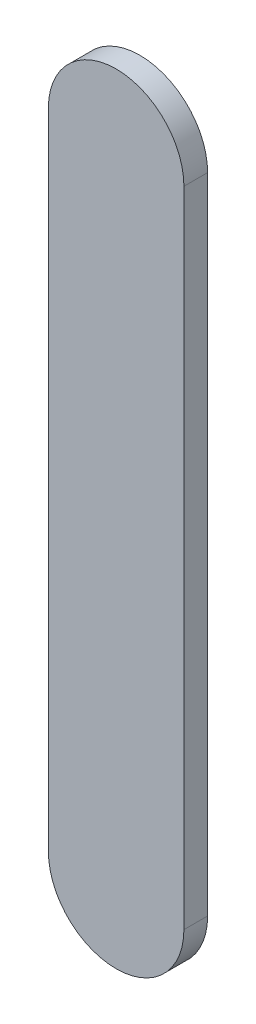
ISO-10303-21;
HEADER;
FILE_DESCRIPTION(('STEP AP214'),'2;1');
FILE_NAME('part.step','',(''),(''),'','','');
FILE_SCHEMA(('AUTOMOTIVE_DESIGN { 1 0 10303 214 1 1 1 1 }'));
ENDSEC;
DATA;
#1=APPLICATION_CONTEXT('core data for automotive mechanical design processes');
#2=APPLICATION_PROTOCOL_DEFINITION('international standard','automotive_design',2000,#1);
#3=PRODUCT_CONTEXT('',#1,'mechanical');
#4=PRODUCT('Part','Part','',(#3));
#5=PRODUCT_RELATED_PRODUCT_CATEGORY('part','',(#4));
#6=PRODUCT_DEFINITION_FORMATION('','',#4);
#7=PRODUCT_DEFINITION_CONTEXT('part definition',#1,'design');
#8=PRODUCT_DEFINITION('design','',#6,#7);
#9=PRODUCT_DEFINITION_SHAPE('','',#8);
#10=(LENGTH_UNIT() NAMED_UNIT(*) SI_UNIT(.MILLI.,.METRE.));
#11=(NAMED_UNIT(*) PLANE_ANGLE_UNIT() SI_UNIT($,.RADIAN.));
#12=(NAMED_UNIT(*) SI_UNIT($,.STERADIAN.) SOLID_ANGLE_UNIT());
#13=UNCERTAINTY_MEASURE_WITH_UNIT(LENGTH_MEASURE(1.E-05),#10,'distance_accuracy_value','');
#14=(GEOMETRIC_REPRESENTATION_CONTEXT(3) GLOBAL_UNCERTAINTY_ASSIGNED_CONTEXT((#13)) GLOBAL_UNIT_ASSIGNED_CONTEXT((#10,
#11,#12)) REPRESENTATION_CONTEXT('',''));
#15=CARTESIAN_POINT('',(0.,0.,0.));
#16=DIRECTION('',(0.,0.,1.));
#17=DIRECTION('',(1.,0.,0.));
#18=AXIS2_PLACEMENT_3D('',#15,#16,#17);
#19=CARTESIAN_POINT('',(79.55,-117.55,1.635));
#20=DIRECTION('',(0.,0.,1.));
#21=DIRECTION('',(1.,0.,0.));
#22=AXIS2_PLACEMENT_3D('',#19,#20,#21);
#23=PLANE('',#22);
#24=DIRECTION('',(0.,-1.,0.));
#25=VECTOR('',#24,1.);
#26=CARTESIAN_POINT('',(79.55,-117.55,1.635));
#27=LINE('',#26,#25);
#28=CARTESIAN_POINT('',(79.55,-117.55,1.635));
#29=VERTEX_POINT('',#28);
#30=CARTESIAN_POINT('',(79.55,-118.5,1.635));
#31=VERTEX_POINT('',#30);
#32=EDGE_CURVE('E82',#29,#31,#27,.T.);
#33=ORIENTED_EDGE('',*,*,#32,.T.);
#34=CARTESIAN_POINT('',(79.65,-118.5,1.635));
#35=DIRECTION('',(0.,0.,1.));
#36=DIRECTION('',(-1.,-1.42108547152E-13,0.));
#37=AXIS2_PLACEMENT_3D('',#34,#35,#36);
#38=CIRCLE('',#37,0.1);
#39=CARTESIAN_POINT('',(79.75,-118.5,1.635));
#40=VERTEX_POINT('',#39);
#41=EDGE_CURVE('E107',#31,#40,#38,.T.);
#42=ORIENTED_EDGE('',*,*,#41,.T.);
#43=DIRECTION('',(0.,1.,0.));
#44=VECTOR('',#43,1.);
#45=CARTESIAN_POINT('',(79.75,-118.5,1.635));
#46=LINE('',#45,#44);
#47=CARTESIAN_POINT('',(79.75,-117.55,1.635));
#48=VERTEX_POINT('',#47);
#49=EDGE_CURVE('E74',#40,#48,#46,.T.);
#50=ORIENTED_EDGE('',*,*,#49,.T.);
#51=CARTESIAN_POINT('',(79.65,-117.55,1.635));
#52=DIRECTION('',(0.,0.,1.));
#53=DIRECTION('',(1.,1.42108547152E-13,0.));
#54=AXIS2_PLACEMENT_3D('',#51,#52,#53);
#55=CIRCLE('',#54,0.1);
#56=EDGE_CURVE('E11',#48,#29,#55,.T.);
#57=ORIENTED_EDGE('',*,*,#56,.T.);
#58=EDGE_LOOP('',(#33,#42,#50,#57));
#59=FACE_BOUND('',#58,.T.);
#60=ADVANCED_FACE('F17',(#59),#23,.T.);
#61=CARTESIAN_POINT('',(79.55,-117.55,1.6));
#62=DIRECTION('',(0.,0.,1.));
#63=DIRECTION('',(1.,0.,0.));
#64=AXIS2_PLACEMENT_3D('',#61,#62,#63);
#65=PLANE('',#64);
#66=CARTESIAN_POINT('',(79.65,-117.55,1.6));
#67=DIRECTION('',(0.,0.,1.));
#68=DIRECTION('',(1.,1.42108547152E-13,0.));
#69=AXIS2_PLACEMENT_3D('',#66,#67,#68);
#70=CIRCLE('',#69,0.1);
#71=CARTESIAN_POINT('',(79.75,-117.55,1.6));
#72=VERTEX_POINT('',#71);
#73=CARTESIAN_POINT('',(79.55,-117.55,1.6));
#74=VERTEX_POINT('',#73);
#75=EDGE_CURVE('E25',#72,#74,#70,.T.);
#76=ORIENTED_EDGE('',*,*,#75,.F.);
#77=DIRECTION('',(0.,1.,0.));
#78=VECTOR('',#77,1.);
#79=CARTESIAN_POINT('',(79.75,-118.5,1.6));
#80=LINE('',#79,#78);
#81=CARTESIAN_POINT('',(79.75,-118.5,1.6));
#82=VERTEX_POINT('',#81);
#83=EDGE_CURVE('E104',#82,#72,#80,.T.);
#84=ORIENTED_EDGE('',*,*,#83,.F.);
#85=CARTESIAN_POINT('',(79.65,-118.5,1.6));
#86=DIRECTION('',(0.,0.,1.));
#87=DIRECTION('',(-1.,-1.42108547152E-13,0.));
#88=AXIS2_PLACEMENT_3D('',#85,#86,#87);
#89=CIRCLE('',#88,0.1);
#90=CARTESIAN_POINT('',(79.55,-118.5,1.6));
#91=VERTEX_POINT('',#90);
#92=EDGE_CURVE('E84',#91,#82,#89,.T.);
#93=ORIENTED_EDGE('',*,*,#92,.F.);
#94=DIRECTION('',(0.,-1.,0.));
#95=VECTOR('',#94,1.);
#96=CARTESIAN_POINT('',(79.55,-117.55,1.6));
#97=LINE('',#96,#95);
#98=EDGE_CURVE('E80',#74,#91,#97,.T.);
#99=ORIENTED_EDGE('',*,*,#98,.F.);
#100=EDGE_LOOP('',(#76,#84,#93,#99));
#101=FACE_BOUND('',#100,.T.);
#102=ADVANCED_FACE('F86',(#101),#65,.F.);
#103=CARTESIAN_POINT('',(79.65,-117.55,1.6));
#104=DIRECTION('',(0.,0.,-1.));
#105=DIRECTION('',(1.,1.42108547152E-13,0.));
#106=AXIS2_PLACEMENT_3D('',#103,#104,#105);
#107=CYLINDRICAL_SURFACE('',#106,0.1);
#108=ORIENTED_EDGE('',*,*,#75,.T.);
#109=DIRECTION('',(0.,0.,1.));
#110=VECTOR('',#109,1.);
#111=CARTESIAN_POINT('',(79.55,-117.55,1.6));
#112=LINE('',#111,#110);
#113=EDGE_CURVE('E68',#74,#29,#112,.T.);
#114=ORIENTED_EDGE('',*,*,#113,.T.);
#115=ORIENTED_EDGE('',*,*,#56,.F.);
#116=DIRECTION('',(0.,0.,1.));
#117=VECTOR('',#116,1.);
#118=CARTESIAN_POINT('',(79.75,-117.55,1.6));
#119=LINE('',#118,#117);
#120=EDGE_CURVE('E71',#72,#48,#119,.T.);
#121=ORIENTED_EDGE('',*,*,#120,.F.);
#122=EDGE_LOOP('',(#108,#114,#115,#121));
#123=FACE_BOUND('',#122,.T.);
#124=ADVANCED_FACE('F67',(#123),#107,.T.);
#125=CARTESIAN_POINT('',(79.75,-118.5,1.6));
#126=DIRECTION('',(-1.,0.,0.));
#127=DIRECTION('',(0.,0.,1.));
#128=AXIS2_PLACEMENT_3D('',#125,#126,#127);
#129=PLANE('',#128);
#130=ORIENTED_EDGE('',*,*,#83,.T.);
#131=ORIENTED_EDGE('',*,*,#120,.T.);
#132=ORIENTED_EDGE('',*,*,#49,.F.);
#133=DIRECTION('',(0.,0.,1.));
#134=VECTOR('',#133,1.);
#135=CARTESIAN_POINT('',(79.75,-118.5,1.6));
#136=LINE('',#135,#134);
#137=EDGE_CURVE('E102',#82,#40,#136,.T.);
#138=ORIENTED_EDGE('',*,*,#137,.F.);
#139=EDGE_LOOP('',(#130,#131,#132,#138));
#140=FACE_BOUND('',#139,.T.);
#141=ADVANCED_FACE('F117',(#140),#129,.F.);
#142=CARTESIAN_POINT('',(79.65,-118.5,1.6));
#143=DIRECTION('',(0.,0.,-1.));
#144=DIRECTION('',(-1.,-1.42108547152E-13,0.));
#145=AXIS2_PLACEMENT_3D('',#142,#143,#144);
#146=CYLINDRICAL_SURFACE('',#145,0.1);
#147=ORIENTED_EDGE('',*,*,#92,.T.);
#148=ORIENTED_EDGE('',*,*,#137,.T.);
#149=ORIENTED_EDGE('',*,*,#41,.F.);
#150=DIRECTION('',(0.,0.,1.));
#151=VECTOR('',#150,1.);
#152=CARTESIAN_POINT('',(79.55,-118.5,1.6));
#153=LINE('',#152,#151);
#154=EDGE_CURVE('E90',#91,#31,#153,.T.);
#155=ORIENTED_EDGE('',*,*,#154,.F.);
#156=EDGE_LOOP('',(#147,#148,#149,#155));
#157=FACE_BOUND('',#156,.T.);
#158=ADVANCED_FACE('F120',(#157),#146,.T.);
#159=CARTESIAN_POINT('',(79.55,-117.55,1.6));
#160=DIRECTION('',(1.,0.,0.));
#161=DIRECTION('',(0.,1.,0.));
#162=AXIS2_PLACEMENT_3D('',#159,#160,#161);
#163=PLANE('',#162);
#164=ORIENTED_EDGE('',*,*,#98,.T.);
#165=ORIENTED_EDGE('',*,*,#154,.T.);
#166=ORIENTED_EDGE('',*,*,#32,.F.);
#167=ORIENTED_EDGE('',*,*,#113,.F.);
#168=EDGE_LOOP('',(#164,#165,#166,#167));
#169=FACE_BOUND('',#168,.T.);
#170=ADVANCED_FACE('F78',(#169),#163,.F.);
#171=CLOSED_SHELL('',(#60,#102,#124,#141,#158,#170));
#172=MANIFOLD_SOLID_BREP('B1',#171);
#173=ADVANCED_BREP_SHAPE_REPRESENTATION('',(#18,#172),#14);
#174=SHAPE_DEFINITION_REPRESENTATION(#9,#173);
ENDSEC;
END-ISO-10303-21;
